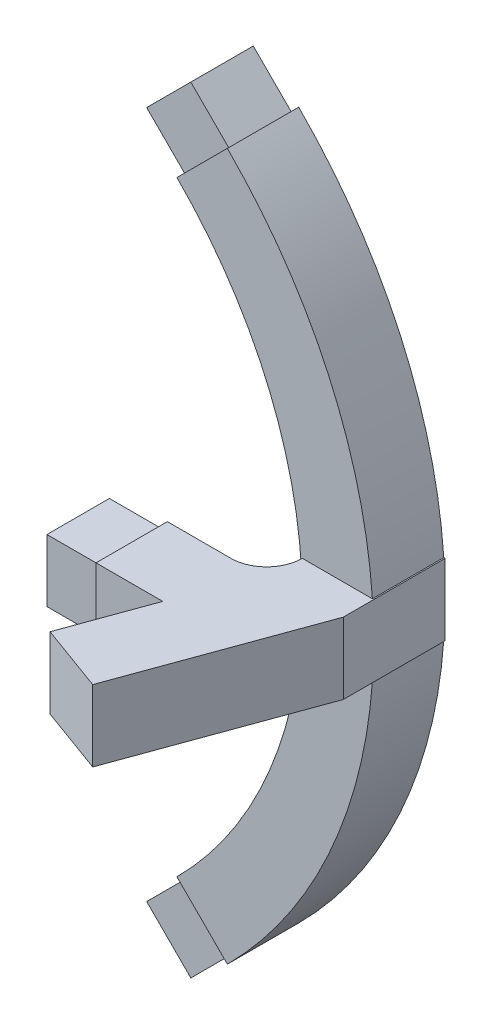
ISO-10303-21;
HEADER;
FILE_DESCRIPTION(('STEP AP214'),'2;1');
FILE_NAME('part.step','',(''),(''),'','','');
FILE_SCHEMA(('AUTOMOTIVE_DESIGN { 1 0 10303 214 1 1 1 1 }'));
ENDSEC;
DATA;
#1=APPLICATION_CONTEXT('core data for automotive mechanical design processes');
#2=APPLICATION_PROTOCOL_DEFINITION('international standard','automotive_design',2000,#1);
#3=PRODUCT_CONTEXT('',#1,'mechanical');
#4=PRODUCT('Part','Part','',(#3));
#5=PRODUCT_RELATED_PRODUCT_CATEGORY('part','',(#4));
#6=PRODUCT_DEFINITION_FORMATION('','',#4);
#7=PRODUCT_DEFINITION_CONTEXT('part definition',#1,'design');
#8=PRODUCT_DEFINITION('design','',#6,#7);
#9=PRODUCT_DEFINITION_SHAPE('','',#8);
#10=(LENGTH_UNIT() NAMED_UNIT(*) SI_UNIT(.MILLI.,.METRE.));
#11=(NAMED_UNIT(*) PLANE_ANGLE_UNIT() SI_UNIT($,.RADIAN.));
#12=(NAMED_UNIT(*) SI_UNIT($,.STERADIAN.) SOLID_ANGLE_UNIT());
#13=UNCERTAINTY_MEASURE_WITH_UNIT(LENGTH_MEASURE(1.E-05),#10,'distance_accuracy_value','');
#14=(GEOMETRIC_REPRESENTATION_CONTEXT(3) GLOBAL_UNCERTAINTY_ASSIGNED_CONTEXT((#13)) GLOBAL_UNIT_ASSIGNED_CONTEXT((#10,
#11,#12)) REPRESENTATION_CONTEXT('',''));
#15=CARTESIAN_POINT('',(0.,0.,0.));
#16=DIRECTION('',(0.,0.,1.));
#17=DIRECTION('',(1.,0.,0.));
#18=AXIS2_PLACEMENT_3D('',#15,#16,#17);
#19=CARTESIAN_POINT('',(-50.8,25.4,0.));
#20=DIRECTION('',(-1.,0.,0.));
#21=DIRECTION('',(0.,0.,1.));
#22=AXIS2_PLACEMENT_3D('',#19,#20,#21);
#23=PLANE('',#22);
#24=DIRECTION('',(0.,0.,-1.));
#25=VECTOR('',#24,1.);
#26=CARTESIAN_POINT('',(-50.8,0.,0.));
#27=LINE('',#26,#25);
#28=CARTESIAN_POINT('',(-50.8,0.,0.));
#29=VERTEX_POINT('',#28);
#30=CARTESIAN_POINT('',(-50.8,0.,-25.4));
#31=VERTEX_POINT('',#30);
#32=EDGE_CURVE('E422',#29,#31,#27,.T.);
#33=ORIENTED_EDGE('',*,*,#32,.F.);
#34=DIRECTION('',(0.,-1.,0.));
#35=VECTOR('',#34,1.);
#36=CARTESIAN_POINT('',(-50.8,25.4,0.));
#37=LINE('',#36,#35);
#38=CARTESIAN_POINT('',(-50.8,25.4,0.));
#39=VERTEX_POINT('',#38);
#40=EDGE_CURVE('E428',#39,#29,#37,.T.);
#41=ORIENTED_EDGE('',*,*,#40,.F.);
#42=DIRECTION('',(0.,0.,-1.));
#43=VECTOR('',#42,1.);
#44=CARTESIAN_POINT('',(-50.8,25.4,0.));
#45=LINE('',#44,#43);
#46=CARTESIAN_POINT('',(-50.8,25.4,-25.4));
#47=VERTEX_POINT('',#46);
#48=EDGE_CURVE('E409',#39,#47,#45,.T.);
#49=ORIENTED_EDGE('',*,*,#48,.T.);
#50=DIRECTION('',(0.,-1.,0.));
#51=VECTOR('',#50,1.);
#52=CARTESIAN_POINT('',(-50.8,25.4,-25.4));
#53=LINE('',#52,#51);
#54=EDGE_CURVE('E430',#47,#31,#53,.T.);
#55=ORIENTED_EDGE('',*,*,#54,.T.);
#56=EDGE_LOOP('',(#33,#41,#49,#55));
#57=FACE_BOUND('',#56,.T.);
#58=DIRECTION('',(0.,1.,0.));
#59=VECTOR('',#58,1.);
#60=CARTESIAN_POINT('',(-50.8,0.,-1.5875));
#61=LINE('',#60,#59);
#62=CARTESIAN_POINT('',(-50.8,1.58750000000001,-1.5875));
#63=VERTEX_POINT('',#62);
#64=CARTESIAN_POINT('',(-50.8,23.8125,-1.58749999999999));
#65=VERTEX_POINT('',#64);
#66=EDGE_CURVE('E94',#63,#65,#61,.T.);
#67=ORIENTED_EDGE('',*,*,#66,.F.);
#68=DIRECTION('',(0.,0.,1.));
#69=VECTOR('',#68,1.);
#70=CARTESIAN_POINT('',(-50.8,1.5875,0.));
#71=LINE('',#70,#69);
#72=CARTESIAN_POINT('',(-50.8,1.5875,-23.8125));
#73=VERTEX_POINT('',#72);
#74=EDGE_CURVE('E281',#73,#63,#71,.T.);
#75=ORIENTED_EDGE('',*,*,#74,.F.);
#76=DIRECTION('',(0.,1.,0.));
#77=VECTOR('',#76,1.);
#78=CARTESIAN_POINT('',(-50.8,0.,-23.8125));
#79=LINE('',#78,#77);
#80=CARTESIAN_POINT('',(-50.8,23.8125,-23.8125));
#81=VERTEX_POINT('',#80);
#82=EDGE_CURVE('E278',#73,#81,#79,.T.);
#83=ORIENTED_EDGE('',*,*,#82,.T.);
#84=DIRECTION('',(0.,0.,1.));
#85=VECTOR('',#84,1.);
#86=CARTESIAN_POINT('',(-50.8,23.8125,0.));
#87=LINE('',#86,#85);
#88=EDGE_CURVE('E99',#81,#65,#87,.T.);
#89=ORIENTED_EDGE('',*,*,#88,.T.);
#90=EDGE_LOOP('',(#67,#75,#83,#89));
#91=FACE_BOUND('',#90,.T.);
#92=ADVANCED_FACE('F77',(#57,#91),#23,.T.);
#93=CARTESIAN_POINT('',(-28.1740604829364,25.4,-38.1));
#94=DIRECTION('',(0.,-1.,0.));
#95=DIRECTION('',(0.,0.,-1.));
#96=AXIS2_PLACEMENT_3D('',#93,#94,#95);
#97=CYLINDRICAL_SURFACE('',#96,12.7);
#98=CARTESIAN_POINT('',(-28.1740604829364,0.,-38.1));
#99=DIRECTION('',(0.,1.,0.));
#100=DIRECTION('',(0.,0.,1.));
#101=AXIS2_PLACEMENT_3D('',#98,#99,#100);
#102=CIRCLE('',#101,12.7);
#103=CARTESIAN_POINT('',(-28.1740604829364,0.,-25.4));
#104=VERTEX_POINT('',#103);
#105=CARTESIAN_POINT('',(-15.4740604829365,0.,-38.1));
#106=VERTEX_POINT('',#105);
#107=EDGE_CURVE('E416',#104,#106,#102,.T.);
#108=ORIENTED_EDGE('',*,*,#107,.F.);
#109=DIRECTION('',(0.,-1.,0.));
#110=VECTOR('',#109,1.);
#111=CARTESIAN_POINT('',(-28.1740604829364,25.4,-25.4));
#112=LINE('',#111,#110);
#113=CARTESIAN_POINT('',(-28.1740604829364,25.4,-25.4));
#114=VERTEX_POINT('',#113);
#115=EDGE_CURVE('E432',#114,#104,#112,.T.);
#116=ORIENTED_EDGE('',*,*,#115,.F.);
#117=CARTESIAN_POINT('',(-28.1740604829364,25.4,-38.1));
#118=DIRECTION('',(0.,1.,0.));
#119=DIRECTION('',(0.,0.,1.));
#120=AXIS2_PLACEMENT_3D('',#117,#118,#119);
#121=CIRCLE('',#120,12.7);
#122=CARTESIAN_POINT('',(-15.4740604829365,25.4,-38.1));
#123=VERTEX_POINT('',#122);
#124=EDGE_CURVE('E402',#114,#123,#121,.T.);
#125=ORIENTED_EDGE('',*,*,#124,.T.);
#126=DIRECTION('',(0.,-1.,0.));
#127=VECTOR('',#126,1.);
#128=CARTESIAN_POINT('',(-15.4740604829365,25.4,-38.1));
#129=LINE('',#128,#127);
#130=CARTESIAN_POINT('',(-15.4740604829365,12.7,-38.1));
#131=VERTEX_POINT('',#130);
#132=EDGE_CURVE('E12',#123,#131,#129,.T.);
#133=ORIENTED_EDGE('',*,*,#132,.T.);
#134=EDGE_CURVE('E86',#131,#106,#129,.T.);
#135=ORIENTED_EDGE('',*,*,#134,.T.);
#136=EDGE_LOOP('',(#108,#116,#125,#133,#135));
#137=FACE_BOUND('',#136,.T.);
#138=ADVANCED_FACE('F500',(#137),#97,.F.);
#139=CARTESIAN_POINT('',(0.,25.4,-25.4));
#140=DIRECTION('',(0.,0.,-1.));
#141=DIRECTION('',(-1.,0.,0.));
#142=AXIS2_PLACEMENT_3D('',#139,#140,#141);
#143=PLANE('',#142);
#144=DIRECTION('',(1.,0.,0.));
#145=VECTOR('',#144,1.);
#146=CARTESIAN_POINT('',(0.,0.,-25.4));
#147=LINE('',#146,#145);
#148=EDGE_CURVE('E419',#31,#104,#147,.T.);
#149=ORIENTED_EDGE('',*,*,#148,.F.);
#150=ORIENTED_EDGE('',*,*,#54,.F.);
#151=DIRECTION('',(1.,0.,0.));
#152=VECTOR('',#151,1.);
#153=CARTESIAN_POINT('',(0.,25.4,-25.4));
#154=LINE('',#153,#152);
#155=EDGE_CURVE('E405',#47,#114,#154,.T.);
#156=ORIENTED_EDGE('',*,*,#155,.T.);
#157=ORIENTED_EDGE('',*,*,#115,.T.);
#158=EDGE_LOOP('',(#149,#150,#156,#157));
#159=FACE_BOUND('',#158,.T.);
#160=ADVANCED_FACE('F496',(#159),#143,.T.);
#161=CARTESIAN_POINT('',(0.,25.4,-2.36496704738954E-12));
#162=DIRECTION('',(0.,0.,1.));
#163=DIRECTION('',(1.,0.,0.));
#164=AXIS2_PLACEMENT_3D('',#161,#162,#163);
#165=PLANE('',#164);
#166=DIRECTION('',(-1.,0.,0.));
#167=VECTOR('',#166,1.);
#168=CARTESIAN_POINT('',(0.,0.,-2.36496704738954E-12));
#169=LINE('',#168,#167);
#170=CARTESIAN_POINT('',(-27.0301154208934,0.,-1.10328413072125E-12));
#171=VERTEX_POINT('',#170);
#172=EDGE_CURVE('E406',#171,#29,#169,.T.);
#173=ORIENTED_EDGE('',*,*,#172,.F.);
#174=DIRECTION('',(0.,-1.,0.));
#175=VECTOR('',#174,1.);
#176=CARTESIAN_POINT('',(-27.0301154208934,25.4,-1.10328413072125E-12));
#177=LINE('',#176,#175);
#178=CARTESIAN_POINT('',(-27.0301154208934,25.4,-1.10328413072125E-12));
#179=VERTEX_POINT('',#178);
#180=EDGE_CURVE('E415',#179,#171,#177,.T.);
#181=ORIENTED_EDGE('',*,*,#180,.F.);
#182=DIRECTION('',(-1.,0.,0.));
#183=VECTOR('',#182,1.);
#184=CARTESIAN_POINT('',(0.,25.4,-2.36496704738954E-12));
#185=LINE('',#184,#183);
#186=EDGE_CURVE('E412',#179,#39,#185,.T.);
#187=ORIENTED_EDGE('',*,*,#186,.T.);
#188=ORIENTED_EDGE('',*,*,#40,.T.);
#189=EDGE_LOOP('',(#173,#181,#187,#188));
#190=FACE_BOUND('',#189,.T.);
#191=ADVANCED_FACE('F490',(#190),#165,.T.);
#192=CARTESIAN_POINT('',(0.,0.,0.));
#193=DIRECTION('',(0.,1.,0.));
#194=DIRECTION('',(0.,0.,1.));
#195=AXIS2_PLACEMENT_3D('',#192,#193,#194);
#196=PLANE('',#195);
#197=DIRECTION('',(-0.342020143325665,0.,0.93969262078591));
#198=VECTOR('',#197,1.);
#199=CARTESIAN_POINT('',(-17.7852714705268,0.,-25.4));
#200=LINE('',#199,#198);
#201=CARTESIAN_POINT('',(-37.7354584935044,0.,29.4126883595281));
#202=VERTEX_POINT('',#201);
#203=EDGE_CURVE('E437',#171,#202,#200,.T.);
#204=ORIENTED_EDGE('',*,*,#203,.F.);
#205=ORIENTED_EDGE('',*,*,#172,.T.);
#206=ORIENTED_EDGE('',*,*,#32,.T.);
#207=ORIENTED_EDGE('',*,*,#148,.T.);
#208=ORIENTED_EDGE('',*,*,#107,.T.);
#209=DIRECTION('',(1.,0.,0.));
#210=VECTOR('',#209,1.);
#211=CARTESIAN_POINT('',(-15.4740604829365,0.,-38.1));
#212=LINE('',#211,#210);
#213=CARTESIAN_POINT('',(9.47178807292914,0.,-38.1));
#214=VERTEX_POINT('',#213);
#215=EDGE_CURVE('E457',#106,#214,#212,.T.);
#216=ORIENTED_EDGE('',*,*,#215,.T.);
#217=DIRECTION('',(0.,0.,1.));
#218=VECTOR('',#217,1.);
#219=CARTESIAN_POINT('',(9.47178807292914,0.,-63.5));
#220=LINE('',#219,#218);
#221=CARTESIAN_POINT('',(9.47178807292914,0.,-63.5));
#222=VERTEX_POINT('',#221);
#223=EDGE_CURVE('E392',#222,#214,#220,.T.);
#224=ORIENTED_EDGE('',*,*,#223,.F.);
#225=DIRECTION('',(1.,0.,0.));
#226=VECTOR('',#225,1.);
#227=CARTESIAN_POINT('',(9.47178807292913,0.,-63.5));
#228=LINE('',#227,#226);
#229=CARTESIAN_POINT('',(9.92593951706356,0.,-63.5));
#230=VERTEX_POINT('',#229);
#231=EDGE_CURVE('E360',#222,#230,#228,.T.);
#232=ORIENTED_EDGE('',*,*,#231,.T.);
#233=DIRECTION('',(0.,0.,1.));
#234=VECTOR('',#233,1.);
#235=CARTESIAN_POINT('',(9.92593951706357,0.,-38.1));
#236=LINE('',#235,#234);
#237=CARTESIAN_POINT('',(9.92593951706357,0.,-27.2712946900048));
#238=VERTEX_POINT('',#237);
#239=EDGE_CURVE('E454',#230,#238,#236,.T.);
#240=ORIENTED_EDGE('',*,*,#239,.T.);
#241=DIRECTION('',(0.342020143325666,0.,-0.93969262078591));
#242=VECTOR('',#241,1.);
#243=CARTESIAN_POINT('',(0.,0.,0.));
#244=LINE('',#243,#242);
#245=CARTESIAN_POINT('',(-13.8672659255422,0.,38.1));
#246=VERTEX_POINT('',#245);
#247=EDGE_CURVE('E451',#246,#238,#244,.T.);
#248=ORIENTED_EDGE('',*,*,#247,.F.);
#249=DIRECTION('',(0.93969262078591,0.,0.342020143325665));
#250=VECTOR('',#249,1.);
#251=CARTESIAN_POINT('',(-37.7354584935044,0.,29.4126883595281));
#252=LINE('',#251,#250);
#253=EDGE_CURVE('E401',#202,#246,#252,.T.);
#254=ORIENTED_EDGE('',*,*,#253,.F.);
#255=EDGE_LOOP('',(#204,#205,#206,#207,#208,#216,#224,#232,#240,#248,#254));
#256=FACE_BOUND('',#255,.T.);
#257=ADVANCED_FACE('F474',(#256),#196,.F.);
#258=CARTESIAN_POINT('',(0.,25.4,0.));
#259=DIRECTION('',(0.,1.,0.));
#260=DIRECTION('',(0.,0.,1.));
#261=AXIS2_PLACEMENT_3D('',#258,#259,#260);
#262=PLANE('',#261);
#263=ORIENTED_EDGE('',*,*,#186,.F.);
#264=DIRECTION('',(0.342020143325666,0.,-0.93969262078591));
#265=VECTOR('',#264,1.);
#266=CARTESIAN_POINT('',(-17.7852714705268,25.4,-25.4));
#267=LINE('',#266,#265);
#268=CARTESIAN_POINT('',(-37.7354584935044,25.4,29.4126883595281));
#269=VERTEX_POINT('',#268);
#270=EDGE_CURVE('E445',#269,#179,#267,.T.);
#271=ORIENTED_EDGE('',*,*,#270,.F.);
#272=DIRECTION('',(0.93969262078591,0.,0.342020143325665));
#273=VECTOR('',#272,1.);
#274=CARTESIAN_POINT('',(-37.7354584935044,25.4,29.4126883595281));
#275=LINE('',#274,#273);
#276=CARTESIAN_POINT('',(-13.8672659255422,25.4,38.1));
#277=VERTEX_POINT('',#276);
#278=EDGE_CURVE('E434',#269,#277,#275,.T.);
#279=ORIENTED_EDGE('',*,*,#278,.T.);
#280=DIRECTION('',(-0.342020143325665,0.,0.93969262078591));
#281=VECTOR('',#280,1.);
#282=CARTESIAN_POINT('',(0.,25.4,0.));
#283=LINE('',#282,#281);
#284=CARTESIAN_POINT('',(9.92593951706357,25.4,-27.2712946900048));
#285=VERTEX_POINT('',#284);
#286=EDGE_CURVE('E436',#285,#277,#283,.T.);
#287=ORIENTED_EDGE('',*,*,#286,.F.);
#288=DIRECTION('',(0.,0.,1.));
#289=VECTOR('',#288,1.);
#290=CARTESIAN_POINT('',(9.92593951706357,25.4,-38.1));
#291=LINE('',#290,#289);
#292=CARTESIAN_POINT('',(9.92593951706356,25.4,-63.5));
#293=VERTEX_POINT('',#292);
#294=EDGE_CURVE('E440',#293,#285,#291,.T.);
#295=ORIENTED_EDGE('',*,*,#294,.F.);
#296=DIRECTION('',(1.,0.,0.));
#297=VECTOR('',#296,1.);
#298=CARTESIAN_POINT('',(9.47178807292913,25.4,-63.5));
#299=LINE('',#298,#297);
#300=CARTESIAN_POINT('',(9.47178807292913,25.4,-63.5));
#301=VERTEX_POINT('',#300);
#302=EDGE_CURVE('E354',#301,#293,#299,.T.);
#303=ORIENTED_EDGE('',*,*,#302,.F.);
#304=DIRECTION('',(0.,0.,1.));
#305=VECTOR('',#304,1.);
#306=CARTESIAN_POINT('',(9.47178807292913,25.4,-63.5));
#307=LINE('',#306,#305);
#308=CARTESIAN_POINT('',(9.47178807292914,25.4,-38.1));
#309=VERTEX_POINT('',#308);
#310=EDGE_CURVE('E395',#301,#309,#307,.T.);
#311=ORIENTED_EDGE('',*,*,#310,.T.);
#312=DIRECTION('',(1.,0.,0.));
#313=VECTOR('',#312,1.);
#314=CARTESIAN_POINT('',(-15.4740604829365,25.4,-38.1));
#315=LINE('',#314,#313);
#316=EDGE_CURVE('E443',#123,#309,#315,.T.);
#317=ORIENTED_EDGE('',*,*,#316,.F.);
#318=ORIENTED_EDGE('',*,*,#124,.F.);
#319=ORIENTED_EDGE('',*,*,#155,.F.);
#320=ORIENTED_EDGE('',*,*,#48,.F.);
#321=EDGE_LOOP('',(#263,#271,#279,#287,#295,#303,#311,#317,#318,#319,#320));
#322=FACE_BOUND('',#321,.T.);
#323=ADVANCED_FACE('F485',(#322),#262,.T.);
#324=CARTESIAN_POINT('',(0.,25.4,0.));
#325=DIRECTION('',(-0.93969262078591,0.,-0.342020143325666));
#326=DIRECTION('',(-0.342020143325666,0.,0.93969262078591));
#327=AXIS2_PLACEMENT_3D('',#324,#325,#326);
#328=PLANE('',#327);
#329=ORIENTED_EDGE('',*,*,#247,.T.);
#330=DIRECTION('',(0.,-1.,0.));
#331=VECTOR('',#330,1.);
#332=CARTESIAN_POINT('',(9.92593951706357,25.4,-27.2712946900048));
#333=LINE('',#332,#331);
#334=EDGE_CURVE('E461',#285,#238,#333,.T.);
#335=ORIENTED_EDGE('',*,*,#334,.F.);
#336=ORIENTED_EDGE('',*,*,#286,.T.);
#337=DIRECTION('',(0.,-1.,0.));
#338=VECTOR('',#337,1.);
#339=CARTESIAN_POINT('',(-13.8672659255422,25.4,38.1));
#340=LINE('',#339,#338);
#341=EDGE_CURVE('E81',#277,#246,#340,.T.);
#342=ORIENTED_EDGE('',*,*,#341,.T.);
#343=EDGE_LOOP('',(#329,#335,#336,#342));
#344=FACE_BOUND('',#343,.T.);
#345=ADVANCED_FACE('F467',(#344),#328,.F.);
#346=CARTESIAN_POINT('',(9.92593951706357,25.4,-38.1));
#347=DIRECTION('',(1.,0.,0.));
#348=DIRECTION('',(0.,0.,-1.));
#349=AXIS2_PLACEMENT_3D('',#346,#347,#348);
#350=PLANE('',#349);
#351=ORIENTED_EDGE('',*,*,#239,.F.);
#352=DIRECTION('',(0.,-1.,0.));
#353=VECTOR('',#352,1.);
#354=CARTESIAN_POINT('',(9.92593951706356,25.4,-63.5));
#355=LINE('',#354,#353);
#356=EDGE_CURVE('E357',#293,#230,#355,.T.);
#357=ORIENTED_EDGE('',*,*,#356,.F.);
#358=ORIENTED_EDGE('',*,*,#294,.T.);
#359=ORIENTED_EDGE('',*,*,#334,.T.);
#360=EDGE_LOOP('',(#351,#357,#358,#359));
#361=FACE_BOUND('',#360,.T.);
#362=ADVANCED_FACE('F478',(#361),#350,.T.);
#363=CARTESIAN_POINT('',(-17.7852714705268,25.4,-25.4));
#364=DIRECTION('',(0.93969262078591,0.,0.342020143325665));
#365=DIRECTION('',(0.342020143325665,0.,-0.93969262078591));
#366=AXIS2_PLACEMENT_3D('',#363,#364,#365);
#367=PLANE('',#366);
#368=ORIENTED_EDGE('',*,*,#180,.T.);
#369=ORIENTED_EDGE('',*,*,#203,.T.);
#370=DIRECTION('',(0.,-1.,0.));
#371=VECTOR('',#370,1.);
#372=CARTESIAN_POINT('',(-37.7354584935044,25.4,29.4126883595281));
#373=LINE('',#372,#371);
#374=EDGE_CURVE('E448',#269,#202,#373,.T.);
#375=ORIENTED_EDGE('',*,*,#374,.F.);
#376=ORIENTED_EDGE('',*,*,#270,.T.);
#377=EDGE_LOOP('',(#368,#369,#375,#376));
#378=FACE_BOUND('',#377,.T.);
#379=ADVANCED_FACE('F488',(#378),#367,.F.);
#380=CARTESIAN_POINT('',(-37.7354584935044,25.4,29.4126883595281));
#381=DIRECTION('',(0.342020143325665,0.,-0.939692620785909));
#382=DIRECTION('',(-0.93969262078591,0.,-0.342020143325665));
#383=AXIS2_PLACEMENT_3D('',#380,#381,#382);
#384=PLANE('',#383);
#385=ORIENTED_EDGE('',*,*,#253,.T.);
#386=ORIENTED_EDGE('',*,*,#341,.F.);
#387=ORIENTED_EDGE('',*,*,#278,.F.);
#388=ORIENTED_EDGE('',*,*,#374,.T.);
#389=EDGE_LOOP('',(#385,#386,#387,#388));
#390=FACE_BOUND('',#389,.T.);
#391=ADVANCED_FACE('F79',(#390),#384,.F.);
#392=CARTESIAN_POINT('',(-167.874060482936,12.7,-38.0999999999999));
#393=DIRECTION('',(0.,0.,-1.));
#394=DIRECTION('',(-1.,0.,0.));
#395=AXIS2_PLACEMENT_3D('',#392,#393,#394);
#396=PLANE('',#395);
#397=ORIENTED_EDGE('',*,*,#215,.F.);
#398=ORIENTED_EDGE('',*,*,#134,.F.);
#399=CARTESIAN_POINT('',(-167.874060482936,12.7,-38.0999999999999));
#400=DIRECTION('',(0.,0.,-1.));
#401=DIRECTION('',(-1.,0.,0.));
#402=AXIS2_PLACEMENT_3D('',#399,#400,#401);
#403=CIRCLE('',#402,152.4);
#404=CARTESIAN_POINT('',(-60.1109870301066,-95.0630734528299,-38.1));
#405=VERTEX_POINT('',#404);
#406=EDGE_CURVE('E383',#131,#405,#403,.T.);
#407=ORIENTED_EDGE('',*,*,#406,.T.);
#408=DIRECTION('',(0.707106781186547,-0.707106781186548,0.));
#409=VECTOR('',#408,1.);
#410=CARTESIAN_POINT('',(-60.1109870301066,-95.06307345283,-38.1));
#411=LINE('',#410,#409);
#412=CARTESIAN_POINT('',(-42.1504747879683,-113.023585694968,-38.1));
#413=VERTEX_POINT('',#412);
#414=EDGE_CURVE('E380',#405,#413,#411,.T.);
#415=ORIENTED_EDGE('',*,*,#414,.T.);
#416=CARTESIAN_POINT('',(-167.874060482936,12.7,-38.0999999999999));
#417=DIRECTION('',(0.,0.,-1.));
#418=DIRECTION('',(-1.,0.,0.));
#419=AXIS2_PLACEMENT_3D('',#416,#417,#418);
#420=CIRCLE('',#419,177.8);
#421=EDGE_CURVE('E377',#214,#413,#420,.T.);
#422=ORIENTED_EDGE('',*,*,#421,.F.);
#423=EDGE_LOOP('',(#397,#398,#407,#415,#422));
#424=FACE_BOUND('',#423,.T.);
#425=ADVANCED_FACE('F505',(#424),#396,.F.);
#426=ORIENTED_EDGE('',*,*,#132,.F.);
#427=ORIENTED_EDGE('',*,*,#316,.T.);
#428=CARTESIAN_POINT('',(-167.874060482936,12.7,-38.0999999999999));
#429=DIRECTION('',(0.,0.,-1.));
#430=DIRECTION('',(-1.,0.,0.));
#431=AXIS2_PLACEMENT_3D('',#428,#429,#430);
#432=CIRCLE('',#431,177.8);
#433=CARTESIAN_POINT('',(-42.1504747879683,138.423585694968,-38.1));
#434=VERTEX_POINT('',#433);
#435=EDGE_CURVE('E374',#434,#309,#432,.T.);
#436=ORIENTED_EDGE('',*,*,#435,.F.);
#437=DIRECTION('',(0.707106781186547,0.707106781186548,0.));
#438=VECTOR('',#437,1.);
#439=CARTESIAN_POINT('',(-60.1109870301066,120.46307345283,-38.1));
#440=LINE('',#439,#438);
#441=CARTESIAN_POINT('',(-60.1109870301066,120.46307345283,-38.1));
#442=VERTEX_POINT('',#441);
#443=EDGE_CURVE('E340',#442,#434,#440,.T.);
#444=ORIENTED_EDGE('',*,*,#443,.F.);
#445=EDGE_CURVE('E352',#442,#131,#403,.T.);
#446=ORIENTED_EDGE('',*,*,#445,.T.);
#447=EDGE_LOOP('',(#426,#427,#436,#444,#446));
#448=FACE_BOUND('',#447,.T.);
#449=ADVANCED_FACE('F527',(#448),#396,.F.);
#450=CARTESIAN_POINT('',(-60.1109870301066,120.46307345283,-63.5));
#451=DIRECTION('',(0.707106781186548,-0.707106781186547,0.));
#452=DIRECTION('',(0.707106781186547,0.707106781186548,0.));
#453=AXIS2_PLACEMENT_3D('',#450,#451,#452);
#454=PLANE('',#453);
#455=DIRECTION('',(0.,0.,1.));
#456=VECTOR('',#455,1.);
#457=CARTESIAN_POINT('',(-58.988455014973,121.585605467964,-61.9125));
#458=LINE('',#457,#456);
#459=CARTESIAN_POINT('',(-58.988455014973,121.585605467964,-61.9125));
#460=VERTEX_POINT('',#459);
#461=CARTESIAN_POINT('',(-58.988455014973,121.585605467964,-39.6875));
#462=VERTEX_POINT('',#461);
#463=EDGE_CURVE('E322',#460,#462,#458,.T.);
#464=ORIENTED_EDGE('',*,*,#463,.F.);
#465=DIRECTION('',(0.707106781186547,0.707106781186548,0.));
#466=VECTOR('',#465,1.);
#467=CARTESIAN_POINT('',(-58.988455014973,121.585605467964,-61.9125));
#468=LINE('',#467,#466);
#469=CARTESIAN_POINT('',(-43.273006803102,137.301053679835,-61.9125));
#470=VERTEX_POINT('',#469);
#471=EDGE_CURVE('E317',#460,#470,#468,.T.);
#472=ORIENTED_EDGE('',*,*,#471,.T.);
#473=DIRECTION('',(0.,0.,1.));
#474=VECTOR('',#473,1.);
#475=CARTESIAN_POINT('',(-43.273006803102,137.301053679835,-61.9125));
#476=LINE('',#475,#474);
#477=CARTESIAN_POINT('',(-43.2730068031019,137.301053679835,-39.6875));
#478=VERTEX_POINT('',#477);
#479=EDGE_CURVE('E332',#470,#478,#476,.T.);
#480=ORIENTED_EDGE('',*,*,#479,.T.);
#481=DIRECTION('',(0.707106781186547,0.707106781186548,0.));
#482=VECTOR('',#481,1.);
#483=CARTESIAN_POINT('',(-58.988455014973,121.585605467964,-39.6875));
#484=LINE('',#483,#482);
#485=EDGE_CURVE('E335',#462,#478,#484,.T.);
#486=ORIENTED_EDGE('',*,*,#485,.F.);
#487=EDGE_LOOP('',(#464,#472,#480,#486));
#488=FACE_BOUND('',#487,.T.);
#489=ORIENTED_EDGE('',*,*,#443,.T.);
#490=DIRECTION('',(0.,0.,1.));
#491=VECTOR('',#490,1.);
#492=CARTESIAN_POINT('',(-42.1504747879683,138.423585694968,-63.5));
#493=LINE('',#492,#491);
#494=CARTESIAN_POINT('',(-42.1504747879683,138.423585694968,-63.5));
#495=VERTEX_POINT('',#494);
#496=EDGE_CURVE('E398',#495,#434,#493,.T.);
#497=ORIENTED_EDGE('',*,*,#496,.F.);
#498=DIRECTION('',(0.707106781186547,0.707106781186548,0.));
#499=VECTOR('',#498,1.);
#500=CARTESIAN_POINT('',(-60.1109870301066,120.46307345283,-63.5));
#501=LINE('',#500,#499);
#502=CARTESIAN_POINT('',(-60.1109870301066,120.46307345283,-63.5));
#503=VERTEX_POINT('',#502);
#504=EDGE_CURVE('E348',#503,#495,#501,.T.);
#505=ORIENTED_EDGE('',*,*,#504,.F.);
#506=DIRECTION('',(0.,0.,1.));
#507=VECTOR('',#506,1.);
#508=CARTESIAN_POINT('',(-60.1109870301066,120.46307345283,-63.5));
#509=LINE('',#508,#507);
#510=EDGE_CURVE('E371',#503,#442,#509,.T.);
#511=ORIENTED_EDGE('',*,*,#510,.T.);
#512=EDGE_LOOP('',(#489,#497,#505,#511));
#513=FACE_BOUND('',#512,.T.);
#514=ADVANCED_FACE('F522',(#488,#513),#454,.F.);
#515=CARTESIAN_POINT('',(-167.874060482936,12.7,-63.4999999999999));
#516=DIRECTION('',(0.,0.,1.));
#517=DIRECTION('',(1.,0.,0.));
#518=AXIS2_PLACEMENT_3D('',#515,#516,#517);
#519=CYLINDRICAL_SURFACE('',#518,177.8);
#520=ORIENTED_EDGE('',*,*,#435,.T.);
#521=ORIENTED_EDGE('',*,*,#310,.F.);
#522=CARTESIAN_POINT('',(-167.874060482936,12.7,-63.4999999999999));
#523=DIRECTION('',(0.,0.,-1.));
#524=DIRECTION('',(-1.,0.,0.));
#525=AXIS2_PLACEMENT_3D('',#522,#523,#524);
#526=CIRCLE('',#525,177.8);
#527=EDGE_CURVE('E351',#495,#301,#526,.T.);
#528=ORIENTED_EDGE('',*,*,#527,.F.);
#529=ORIENTED_EDGE('',*,*,#496,.T.);
#530=EDGE_LOOP('',(#520,#521,#528,#529));
#531=FACE_BOUND('',#530,.T.);
#532=ADVANCED_FACE('F524',(#531),#519,.T.);
#533=CARTESIAN_POINT('',(-167.874060482936,12.7,-63.4999999999999));
#534=DIRECTION('',(0.,0.,1.));
#535=DIRECTION('',(1.,0.,0.));
#536=AXIS2_PLACEMENT_3D('',#533,#534,#535);
#537=CYLINDRICAL_SURFACE('',#536,177.8);
#538=ORIENTED_EDGE('',*,*,#421,.T.);
#539=DIRECTION('',(0.,0.,1.));
#540=VECTOR('',#539,1.);
#541=CARTESIAN_POINT('',(-42.1504747879684,-113.023585694968,-63.5));
#542=LINE('',#541,#540);
#543=CARTESIAN_POINT('',(-42.1504747879684,-113.023585694968,-63.5));
#544=VERTEX_POINT('',#543);
#545=EDGE_CURVE('E390',#544,#413,#542,.T.);
#546=ORIENTED_EDGE('',*,*,#545,.F.);
#547=CARTESIAN_POINT('',(-167.874060482936,12.7,-63.4999999999999));
#548=DIRECTION('',(0.,0.,-1.));
#549=DIRECTION('',(-1.,0.,0.));
#550=AXIS2_PLACEMENT_3D('',#547,#548,#549);
#551=CIRCLE('',#550,177.8);
#552=EDGE_CURVE('E363',#222,#544,#551,.T.);
#553=ORIENTED_EDGE('',*,*,#552,.F.);
#554=ORIENTED_EDGE('',*,*,#223,.T.);
#555=EDGE_LOOP('',(#538,#546,#553,#554));
#556=FACE_BOUND('',#555,.T.);
#557=ADVANCED_FACE('F510',(#556),#537,.T.);
#558=CARTESIAN_POINT('',(-60.1109870301066,-95.06307345283,-63.5));
#559=DIRECTION('',(-0.707106781186548,-0.707106781186547,0.));
#560=DIRECTION('',(0.707106781186547,-0.707106781186548,0.));
#561=AXIS2_PLACEMENT_3D('',#558,#559,#560);
#562=PLANE('',#561);
#563=DIRECTION('',(0.707106781186547,-0.707106781186548,0.));
#564=VECTOR('',#563,1.);
#565=CARTESIAN_POINT('',(-77.5870302414684,-77.5870302414683,-39.6875));
#566=LINE('',#565,#564);
#567=CARTESIAN_POINT('',(-58.988455014973,-96.1856054679636,-39.6875));
#568=VERTEX_POINT('',#567);
#569=CARTESIAN_POINT('',(-43.273006803102,-111.901053679835,-39.6875));
#570=VERTEX_POINT('',#569);
#571=EDGE_CURVE('E282',#568,#570,#566,.T.);
#572=ORIENTED_EDGE('',*,*,#571,.T.);
#573=DIRECTION('',(0.,0.,1.));
#574=VECTOR('',#573,1.);
#575=CARTESIAN_POINT('',(-43.273006803102,-111.901053679835,0.));
#576=LINE('',#575,#574);
#577=CARTESIAN_POINT('',(-43.273006803102,-111.901053679835,-61.9125));
#578=VERTEX_POINT('',#577);
#579=EDGE_CURVE('E295',#578,#570,#576,.T.);
#580=ORIENTED_EDGE('',*,*,#579,.F.);
#581=DIRECTION('',(0.707106781186547,-0.707106781186548,0.));
#582=VECTOR('',#581,1.);
#583=CARTESIAN_POINT('',(-77.5870302414684,-77.5870302414683,-61.9125));
#584=LINE('',#583,#582);
#585=CARTESIAN_POINT('',(-58.988455014973,-96.1856054679636,-61.9125));
#586=VERTEX_POINT('',#585);
#587=EDGE_CURVE('E305',#586,#578,#584,.T.);
#588=ORIENTED_EDGE('',*,*,#587,.F.);
#589=DIRECTION('',(0.,0.,1.));
#590=VECTOR('',#589,1.);
#591=CARTESIAN_POINT('',(-58.988455014973,-96.1856054679636,0.));
#592=LINE('',#591,#590);
#593=EDGE_CURVE('E285',#586,#568,#592,.T.);
#594=ORIENTED_EDGE('',*,*,#593,.T.);
#595=EDGE_LOOP('',(#572,#580,#588,#594));
#596=FACE_BOUND('',#595,.T.);
#597=ORIENTED_EDGE('',*,*,#414,.F.);
#598=DIRECTION('',(0.,0.,1.));
#599=VECTOR('',#598,1.);
#600=CARTESIAN_POINT('',(-60.1109870301066,-95.0630734528299,-63.5));
#601=LINE('',#600,#599);
#602=CARTESIAN_POINT('',(-60.1109870301066,-95.0630734528299,-63.5));
#603=VERTEX_POINT('',#602);
#604=EDGE_CURVE('E387',#603,#405,#601,.T.);
#605=ORIENTED_EDGE('',*,*,#604,.F.);
#606=DIRECTION('',(0.707106781186547,-0.707106781186548,0.));
#607=VECTOR('',#606,1.);
#608=CARTESIAN_POINT('',(-60.1109870301066,-95.06307345283,-63.5));
#609=LINE('',#608,#607);
#610=EDGE_CURVE('E365',#603,#544,#609,.T.);
#611=ORIENTED_EDGE('',*,*,#610,.T.);
#612=ORIENTED_EDGE('',*,*,#545,.T.);
#613=EDGE_LOOP('',(#597,#605,#611,#612));
#614=FACE_BOUND('',#613,.T.);
#615=ADVANCED_FACE('F565',(#596,#614),#562,.T.);
#616=CARTESIAN_POINT('',(-167.874060482936,12.7,-63.4999999999999));
#617=DIRECTION('',(0.,0.,1.));
#618=DIRECTION('',(1.,0.,0.));
#619=AXIS2_PLACEMENT_3D('',#616,#617,#618);
#620=CYLINDRICAL_SURFACE('',#619,152.4);
#621=ORIENTED_EDGE('',*,*,#445,.F.);
#622=ORIENTED_EDGE('',*,*,#510,.F.);
#623=CARTESIAN_POINT('',(-167.874060482936,12.7,-63.4999999999999));
#624=DIRECTION('',(0.,0.,-1.));
#625=DIRECTION('',(-1.,0.,0.));
#626=AXIS2_PLACEMENT_3D('',#623,#624,#625);
#627=CIRCLE('',#626,152.4);
#628=EDGE_CURVE('E368',#503,#603,#627,.T.);
#629=ORIENTED_EDGE('',*,*,#628,.T.);
#630=ORIENTED_EDGE('',*,*,#604,.T.);
#631=ORIENTED_EDGE('',*,*,#406,.F.);
#632=EDGE_LOOP('',(#621,#622,#629,#630,#631));
#633=FACE_BOUND('',#632,.T.);
#634=ADVANCED_FACE('F517',(#633),#620,.F.);
#635=CARTESIAN_POINT('',(-167.874060482936,12.7,-63.4999999999999));
#636=DIRECTION('',(0.,0.,-1.));
#637=DIRECTION('',(-1.,0.,0.));
#638=AXIS2_PLACEMENT_3D('',#635,#636,#637);
#639=PLANE('',#638);
#640=ORIENTED_EDGE('',*,*,#504,.T.);
#641=ORIENTED_EDGE('',*,*,#527,.T.);
#642=ORIENTED_EDGE('',*,*,#302,.T.);
#643=ORIENTED_EDGE('',*,*,#356,.T.);
#644=ORIENTED_EDGE('',*,*,#231,.F.);
#645=ORIENTED_EDGE('',*,*,#552,.T.);
#646=ORIENTED_EDGE('',*,*,#610,.F.);
#647=ORIENTED_EDGE('',*,*,#628,.F.);
#648=EDGE_LOOP('',(#640,#641,#642,#643,#644,#645,#646,#647));
#649=FACE_BOUND('',#648,.T.);
#650=ADVANCED_FACE('F480',(#649),#639,.T.);
#651=CARTESIAN_POINT('',(-72.4588391965767,135.055989649567,-61.9125));
#652=DIRECTION('',(0.,0.,-1.));
#653=DIRECTION('',(-1.,0.,0.));
#654=AXIS2_PLACEMENT_3D('',#651,#652,#653);
#655=PLANE('',#654);
#656=ORIENTED_EDGE('',*,*,#471,.F.);
#657=DIRECTION('',(0.707106781186548,-0.707106781186547,0.));
#658=VECTOR('',#657,1.);
#659=CARTESIAN_POINT('',(-72.4588391965767,135.055989649567,-61.9125));
#660=LINE('',#659,#658);
#661=CARTESIAN_POINT('',(-72.4588391965767,135.055989649567,-61.9125));
#662=VERTEX_POINT('',#661);
#663=EDGE_CURVE('E338',#662,#460,#660,.T.);
#664=ORIENTED_EDGE('',*,*,#663,.F.);
#665=DIRECTION('',(0.707106781186547,0.707106781186548,0.));
#666=VECTOR('',#665,1.);
#667=CARTESIAN_POINT('',(-72.4588391965767,135.055989649567,-61.9125));
#668=LINE('',#667,#666);
#669=CARTESIAN_POINT('',(-56.7433909847057,150.771437861438,-61.9125));
#670=VERTEX_POINT('',#669);
#671=EDGE_CURVE('E318',#662,#670,#668,.T.);
#672=ORIENTED_EDGE('',*,*,#671,.T.);
#673=DIRECTION('',(0.707106781186548,-0.707106781186547,0.));
#674=VECTOR('',#673,1.);
#675=CARTESIAN_POINT('',(-56.7433909847057,150.771437861438,-61.9125));
#676=LINE('',#675,#674);
#677=EDGE_CURVE('E329',#670,#470,#676,.T.);
#678=ORIENTED_EDGE('',*,*,#677,.T.);
#679=EDGE_LOOP('',(#656,#664,#672,#678));
#680=FACE_BOUND('',#679,.T.);
#681=ADVANCED_FACE('F572',(#680),#655,.T.);
#682=CARTESIAN_POINT('',(-72.4588391965767,135.055989649567,-61.9125));
#683=DIRECTION('',(0.707106781186547,0.707106781186548,0.));
#684=DIRECTION('',(-0.707106781186548,0.707106781186547,0.));
#685=AXIS2_PLACEMENT_3D('',#682,#683,#684);
#686=PLANE('',#685);
#687=ORIENTED_EDGE('',*,*,#463,.T.);
#688=DIRECTION('',(0.707106781186548,-0.707106781186547,0.));
#689=VECTOR('',#688,1.);
#690=CARTESIAN_POINT('',(-72.4588391965767,135.055989649567,-39.6875));
#691=LINE('',#690,#689);
#692=CARTESIAN_POINT('',(-72.4588391965767,135.055989649567,-39.6875));
#693=VERTEX_POINT('',#692);
#694=EDGE_CURVE('E341',#693,#462,#691,.T.);
#695=ORIENTED_EDGE('',*,*,#694,.F.);
#696=DIRECTION('',(0.,0.,1.));
#697=VECTOR('',#696,1.);
#698=CARTESIAN_POINT('',(-72.4588391965767,135.055989649567,-61.9125));
#699=LINE('',#698,#697);
#700=EDGE_CURVE('E327',#662,#693,#699,.T.);
#701=ORIENTED_EDGE('',*,*,#700,.F.);
#702=ORIENTED_EDGE('',*,*,#663,.T.);
#703=EDGE_LOOP('',(#687,#695,#701,#702));
#704=FACE_BOUND('',#703,.T.);
#705=ADVANCED_FACE('F576',(#704),#686,.F.);
#706=CARTESIAN_POINT('',(-72.4588391965767,135.055989649567,-39.6875));
#707=DIRECTION('',(0.,0.,-1.));
#708=DIRECTION('',(-1.,0.,0.));
#709=AXIS2_PLACEMENT_3D('',#706,#707,#708);
#710=PLANE('',#709);
#711=ORIENTED_EDGE('',*,*,#485,.T.);
#712=DIRECTION('',(0.707106781186548,-0.707106781186547,0.));
#713=VECTOR('',#712,1.);
#714=CARTESIAN_POINT('',(-56.7433909847057,150.771437861438,-39.6875));
#715=LINE('',#714,#713);
#716=CARTESIAN_POINT('',(-56.7433909847057,150.771437861438,-39.6875));
#717=VERTEX_POINT('',#716);
#718=EDGE_CURVE('E344',#717,#478,#715,.T.);
#719=ORIENTED_EDGE('',*,*,#718,.F.);
#720=DIRECTION('',(0.707106781186547,0.707106781186548,0.));
#721=VECTOR('',#720,1.);
#722=CARTESIAN_POINT('',(-72.4588391965767,135.055989649567,-39.6875));
#723=LINE('',#722,#721);
#724=EDGE_CURVE('E325',#693,#717,#723,.T.);
#725=ORIENTED_EDGE('',*,*,#724,.F.);
#726=ORIENTED_EDGE('',*,*,#694,.T.);
#727=EDGE_LOOP('',(#711,#719,#725,#726));
#728=FACE_BOUND('',#727,.T.);
#729=ADVANCED_FACE('F584',(#728),#710,.F.);
#730=CARTESIAN_POINT('',(-56.7433909847057,150.771437861438,-61.9125));
#731=DIRECTION('',(0.707106781186547,0.707106781186548,0.));
#732=DIRECTION('',(-0.707106781186548,0.707106781186547,0.));
#733=AXIS2_PLACEMENT_3D('',#730,#731,#732);
#734=PLANE('',#733);
#735=ORIENTED_EDGE('',*,*,#479,.F.);
#736=ORIENTED_EDGE('',*,*,#677,.F.);
#737=DIRECTION('',(0.,0.,1.));
#738=VECTOR('',#737,1.);
#739=CARTESIAN_POINT('',(-56.7433909847057,150.771437861438,-61.9125));
#740=LINE('',#739,#738);
#741=EDGE_CURVE('E321',#670,#717,#740,.T.);
#742=ORIENTED_EDGE('',*,*,#741,.T.);
#743=ORIENTED_EDGE('',*,*,#718,.T.);
#744=EDGE_LOOP('',(#735,#736,#742,#743));
#745=FACE_BOUND('',#744,.T.);
#746=ADVANCED_FACE('F580',(#745),#734,.T.);
#747=CARTESIAN_POINT('',(-103.757414423072,103.757414423072,0.));
#748=DIRECTION('',(0.707106781186548,-0.707106781186547,0.));
#749=DIRECTION('',(0.707106781186547,0.707106781186548,0.));
#750=AXIS2_PLACEMENT_3D('',#747,#748,#749);
#751=PLANE('',#750);
#752=ORIENTED_EDGE('',*,*,#671,.F.);
#753=ORIENTED_EDGE('',*,*,#700,.T.);
#754=ORIENTED_EDGE('',*,*,#724,.T.);
#755=ORIENTED_EDGE('',*,*,#741,.F.);
#756=EDGE_LOOP('',(#752,#753,#754,#755));
#757=FACE_BOUND('',#756,.T.);
#758=ADVANCED_FACE('F583',(#757),#751,.F.);
#759=CARTESIAN_POINT('',(-91.0574144230721,-91.057414423072,-39.6875));
#760=DIRECTION('',(0.,0.,1.));
#761=DIRECTION('',(1.,0.,0.));
#762=AXIS2_PLACEMENT_3D('',#759,#760,#761);
#763=PLANE('',#762);
#764=ORIENTED_EDGE('',*,*,#571,.F.);
#765=DIRECTION('',(0.707106781186548,0.707106781186547,0.));
#766=VECTOR('',#765,1.);
#767=CARTESIAN_POINT('',(-72.4588391965768,-109.655989649567,-39.6875));
#768=LINE('',#767,#766);
#769=CARTESIAN_POINT('',(-72.4588391965768,-109.655989649567,-39.6875));
#770=VERTEX_POINT('',#769);
#771=EDGE_CURVE('E315',#770,#568,#768,.T.);
#772=ORIENTED_EDGE('',*,*,#771,.F.);
#773=DIRECTION('',(0.707106781186547,-0.707106781186548,0.));
#774=VECTOR('',#773,1.);
#775=CARTESIAN_POINT('',(-91.0574144230721,-91.057414423072,-39.6875));
#776=LINE('',#775,#774);
#777=CARTESIAN_POINT('',(-56.7433909847058,-125.371437861438,-39.6875));
#778=VERTEX_POINT('',#777);
#779=EDGE_CURVE('E291',#770,#778,#776,.T.);
#780=ORIENTED_EDGE('',*,*,#779,.T.);
#781=DIRECTION('',(0.707106781186548,0.707106781186547,0.));
#782=VECTOR('',#781,1.);
#783=CARTESIAN_POINT('',(-56.7433909847058,-125.371437861438,-39.6875));
#784=LINE('',#783,#782);
#785=EDGE_CURVE('E301',#778,#570,#784,.T.);
#786=ORIENTED_EDGE('',*,*,#785,.T.);
#787=EDGE_LOOP('',(#764,#772,#780,#786));
#788=FACE_BOUND('',#787,.T.);
#789=ADVANCED_FACE('F594',(#788),#763,.T.);
#790=CARTESIAN_POINT('',(-72.4588391965768,-109.655989649567,0.));
#791=DIRECTION('',(-0.707106781186547,0.707106781186548,0.));
#792=DIRECTION('',(-0.707106781186548,-0.707106781186547,0.));
#793=AXIS2_PLACEMENT_3D('',#790,#791,#792);
#794=PLANE('',#793);
#795=ORIENTED_EDGE('',*,*,#593,.F.);
#796=DIRECTION('',(0.707106781186548,0.707106781186547,0.));
#797=VECTOR('',#796,1.);
#798=CARTESIAN_POINT('',(-72.4588391965768,-109.655989649567,-61.9125));
#799=LINE('',#798,#797);
#800=CARTESIAN_POINT('',(-72.4588391965768,-109.655989649567,-61.9125));
#801=VERTEX_POINT('',#800);
#802=EDGE_CURVE('E313',#801,#586,#799,.T.);
#803=ORIENTED_EDGE('',*,*,#802,.F.);
#804=DIRECTION('',(0.,0.,1.));
#805=VECTOR('',#804,1.);
#806=CARTESIAN_POINT('',(-72.4588391965768,-109.655989649567,0.));
#807=LINE('',#806,#805);
#808=EDGE_CURVE('E294',#801,#770,#807,.T.);
#809=ORIENTED_EDGE('',*,*,#808,.T.);
#810=ORIENTED_EDGE('',*,*,#771,.T.);
#811=EDGE_LOOP('',(#795,#803,#809,#810));
#812=FACE_BOUND('',#811,.T.);
#813=ADVANCED_FACE('F598',(#812),#794,.T.);
#814=CARTESIAN_POINT('',(-91.0574144230721,-91.057414423072,-61.9125));
#815=DIRECTION('',(0.,0.,1.));
#816=DIRECTION('',(1.,0.,0.));
#817=AXIS2_PLACEMENT_3D('',#814,#815,#816);
#818=PLANE('',#817);
#819=ORIENTED_EDGE('',*,*,#587,.T.);
#820=DIRECTION('',(0.707106781186548,0.707106781186547,0.));
#821=VECTOR('',#820,1.);
#822=CARTESIAN_POINT('',(-56.7433909847058,-125.371437861438,-61.9125));
#823=LINE('',#822,#821);
#824=CARTESIAN_POINT('',(-56.7433909847058,-125.371437861438,-61.9125));
#825=VERTEX_POINT('',#824);
#826=EDGE_CURVE('E311',#825,#578,#823,.T.);
#827=ORIENTED_EDGE('',*,*,#826,.F.);
#828=DIRECTION('',(0.707106781186547,-0.707106781186548,0.));
#829=VECTOR('',#828,1.);
#830=CARTESIAN_POINT('',(-91.0574144230721,-91.057414423072,-61.9125));
#831=LINE('',#830,#829);
#832=EDGE_CURVE('E298',#801,#825,#831,.T.);
#833=ORIENTED_EDGE('',*,*,#832,.F.);
#834=ORIENTED_EDGE('',*,*,#802,.T.);
#835=EDGE_LOOP('',(#819,#827,#833,#834));
#836=FACE_BOUND('',#835,.T.);
#837=ADVANCED_FACE('F602',(#836),#818,.F.);
#838=CARTESIAN_POINT('',(-56.7433909847058,-125.371437861438,0.));
#839=DIRECTION('',(-0.707106781186547,0.707106781186548,0.));
#840=DIRECTION('',(-0.707106781186548,-0.707106781186547,0.));
#841=AXIS2_PLACEMENT_3D('',#838,#839,#840);
#842=PLANE('',#841);
#843=ORIENTED_EDGE('',*,*,#579,.T.);
#844=ORIENTED_EDGE('',*,*,#785,.F.);
#845=DIRECTION('',(0.,0.,1.));
#846=VECTOR('',#845,1.);
#847=CARTESIAN_POINT('',(-56.7433909847058,-125.371437861438,0.));
#848=LINE('',#847,#846);
#849=EDGE_CURVE('E300',#825,#778,#848,.T.);
#850=ORIENTED_EDGE('',*,*,#849,.F.);
#851=ORIENTED_EDGE('',*,*,#826,.T.);
#852=EDGE_LOOP('',(#843,#844,#850,#851));
#853=FACE_BOUND('',#852,.T.);
#854=ADVANCED_FACE('F606',(#853),#842,.F.);
#855=CARTESIAN_POINT('',(-91.0574144230721,-91.057414423072,0.));
#856=DIRECTION('',(-0.707106781186548,-0.707106781186547,0.));
#857=DIRECTION('',(0.707106781186547,-0.707106781186548,0.));
#858=AXIS2_PLACEMENT_3D('',#855,#856,#857);
#859=PLANE('',#858);
#860=ORIENTED_EDGE('',*,*,#779,.F.);
#861=ORIENTED_EDGE('',*,*,#808,.F.);
#862=ORIENTED_EDGE('',*,*,#832,.T.);
#863=ORIENTED_EDGE('',*,*,#849,.T.);
#864=EDGE_LOOP('',(#860,#861,#862,#863));
#865=FACE_BOUND('',#864,.T.);
#866=ADVANCED_FACE('F610',(#865),#859,.T.);
#867=CARTESIAN_POINT('',(-69.85,1.5875,0.));
#868=DIRECTION('',(0.,1.,0.));
#869=DIRECTION('',(0.,0.,1.));
#870=AXIS2_PLACEMENT_3D('',#867,#868,#869);
#871=PLANE('',#870);
#872=ORIENTED_EDGE('',*,*,#74,.T.);
#873=DIRECTION('',(1.,0.,0.));
#874=VECTOR('',#873,1.);
#875=CARTESIAN_POINT('',(-69.85,1.5875,-1.5875));
#876=LINE('',#875,#874);
#877=CARTESIAN_POINT('',(-69.85,1.5875,-1.5875));
#878=VERTEX_POINT('',#877);
#879=EDGE_CURVE('E262',#878,#63,#876,.T.);
#880=ORIENTED_EDGE('',*,*,#879,.F.);
#881=DIRECTION('',(0.,0.,1.));
#882=VECTOR('',#881,1.);
#883=CARTESIAN_POINT('',(-69.85,1.5875,0.));
#884=LINE('',#883,#882);
#885=CARTESIAN_POINT('',(-69.85,1.5875,-23.8125));
#886=VERTEX_POINT('',#885);
#887=EDGE_CURVE('E269',#886,#878,#884,.T.);
#888=ORIENTED_EDGE('',*,*,#887,.F.);
#889=DIRECTION('',(1.,0.,0.));
#890=VECTOR('',#889,1.);
#891=CARTESIAN_POINT('',(-69.85,1.5875,-23.8125));
#892=LINE('',#891,#890);
#893=EDGE_CURVE('E839',#886,#73,#892,.T.);
#894=ORIENTED_EDGE('',*,*,#893,.T.);
#895=EDGE_LOOP('',(#872,#880,#888,#894));
#896=FACE_BOUND('',#895,.T.);
#897=ADVANCED_FACE('F280',(#896),#871,.F.);
#898=CARTESIAN_POINT('',(-69.85,0.,-1.5875));
#899=DIRECTION('',(0.,0.,-1.));
#900=DIRECTION('',(0.,1.,0.));
#901=AXIS2_PLACEMENT_3D('',#898,#899,#900);
#902=PLANE('',#901);
#903=ORIENTED_EDGE('',*,*,#66,.T.);
#904=DIRECTION('',(1.,0.,0.));
#905=VECTOR('',#904,1.);
#906=CARTESIAN_POINT('',(-69.85,23.8125,-1.58749999999999));
#907=LINE('',#906,#905);
#908=CARTESIAN_POINT('',(-69.85,23.8125,-1.58749999999999));
#909=VERTEX_POINT('',#908);
#910=EDGE_CURVE('E264',#909,#65,#907,.T.);
#911=ORIENTED_EDGE('',*,*,#910,.F.);
#912=DIRECTION('',(0.,1.,0.));
#913=VECTOR('',#912,1.);
#914=CARTESIAN_POINT('',(-69.85,0.,-1.5875));
#915=LINE('',#914,#913);
#916=EDGE_CURVE('E258',#878,#909,#915,.T.);
#917=ORIENTED_EDGE('',*,*,#916,.F.);
#918=ORIENTED_EDGE('',*,*,#879,.T.);
#919=EDGE_LOOP('',(#903,#911,#917,#918));
#920=FACE_BOUND('',#919,.T.);
#921=ADVANCED_FACE('F260',(#920),#902,.F.);
#922=CARTESIAN_POINT('',(-69.85,23.8125,0.));
#923=DIRECTION('',(0.,1.,0.));
#924=DIRECTION('',(0.,0.,1.));
#925=AXIS2_PLACEMENT_3D('',#922,#923,#924);
#926=PLANE('',#925);
#927=ORIENTED_EDGE('',*,*,#88,.F.);
#928=DIRECTION('',(1.,0.,0.));
#929=VECTOR('',#928,1.);
#930=CARTESIAN_POINT('',(-69.85,23.8125,-23.8125));
#931=LINE('',#930,#929);
#932=CARTESIAN_POINT('',(-69.85,23.8125,-23.8125));
#933=VERTEX_POINT('',#932);
#934=EDGE_CURVE('E287',#933,#81,#931,.T.);
#935=ORIENTED_EDGE('',*,*,#934,.F.);
#936=DIRECTION('',(0.,0.,1.));
#937=VECTOR('',#936,1.);
#938=CARTESIAN_POINT('',(-69.85,23.8125,0.));
#939=LINE('',#938,#937);
#940=EDGE_CURVE('E268',#933,#909,#939,.T.);
#941=ORIENTED_EDGE('',*,*,#940,.T.);
#942=ORIENTED_EDGE('',*,*,#910,.T.);
#943=EDGE_LOOP('',(#927,#935,#941,#942));
#944=FACE_BOUND('',#943,.T.);
#945=ADVANCED_FACE('F619',(#944),#926,.T.);
#946=CARTESIAN_POINT('',(-69.85,0.,-23.8125));
#947=DIRECTION('',(0.,0.,-1.));
#948=DIRECTION('',(0.,1.,0.));
#949=AXIS2_PLACEMENT_3D('',#946,#947,#948);
#950=PLANE('',#949);
#951=ORIENTED_EDGE('',*,*,#82,.F.);
#952=ORIENTED_EDGE('',*,*,#893,.F.);
#953=DIRECTION('',(0.,1.,0.));
#954=VECTOR('',#953,1.);
#955=CARTESIAN_POINT('',(-69.85,0.,-23.8125));
#956=LINE('',#955,#954);
#957=EDGE_CURVE('E275',#886,#933,#956,.T.);
#958=ORIENTED_EDGE('',*,*,#957,.T.);
#959=ORIENTED_EDGE('',*,*,#934,.T.);
#960=EDGE_LOOP('',(#951,#952,#958,#959));
#961=FACE_BOUND('',#960,.T.);
#962=ADVANCED_FACE('F622',(#961),#950,.T.);
#963=CARTESIAN_POINT('',(-69.85,0.,0.));
#964=DIRECTION('',(-1.,0.,0.));
#965=DIRECTION('',(0.,0.,1.));
#966=AXIS2_PLACEMENT_3D('',#963,#964,#965);
#967=PLANE('',#966);
#968=ORIENTED_EDGE('',*,*,#887,.T.);
#969=ORIENTED_EDGE('',*,*,#916,.T.);
#970=ORIENTED_EDGE('',*,*,#940,.F.);
#971=ORIENTED_EDGE('',*,*,#957,.F.);
#972=EDGE_LOOP('',(#968,#969,#970,#971));
#973=FACE_BOUND('',#972,.T.);
#974=ADVANCED_FACE('F273',(#973),#967,.T.);
#975=CLOSED_SHELL('',(#92,#138,#160,#191,#257,#323,#345,#362,#379,#391,#425,#449,#514,#532,#557,
#615,#634,#650,#681,#705,#729,#746,#758,#789,#813,#837,#854,#866,#897,#921,#945,#962,#974));
#976=MANIFOLD_SOLID_BREP('B2',#975);
#977=ADVANCED_BREP_SHAPE_REPRESENTATION('',(#18,#976),#14);
#978=SHAPE_DEFINITION_REPRESENTATION(#9,#977);
ENDSEC;
END-ISO-10303-21;
